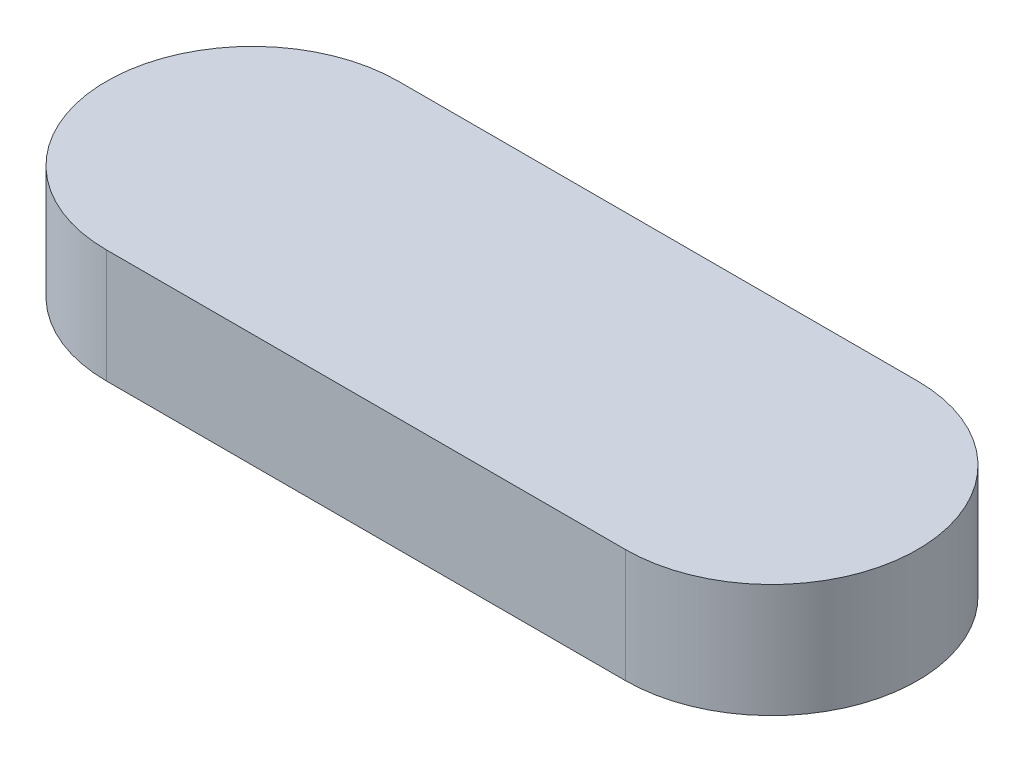
ISO-10303-21;
HEADER;
FILE_DESCRIPTION(('STEP AP214'),'2;1');
FILE_NAME('part.step','',(''),(''),'','','');
FILE_SCHEMA(('AUTOMOTIVE_DESIGN { 1 0 10303 214 1 1 1 1 }'));
ENDSEC;
DATA;
#1=APPLICATION_CONTEXT('core data for automotive mechanical design processes');
#2=APPLICATION_PROTOCOL_DEFINITION('international standard','automotive_design',2000,#1);
#3=PRODUCT_CONTEXT('',#1,'mechanical');
#4=PRODUCT('Part','Part','',(#3));
#5=PRODUCT_RELATED_PRODUCT_CATEGORY('part','',(#4));
#6=PRODUCT_DEFINITION_FORMATION('','',#4);
#7=PRODUCT_DEFINITION_CONTEXT('part definition',#1,'design');
#8=PRODUCT_DEFINITION('design','',#6,#7);
#9=PRODUCT_DEFINITION_SHAPE('','',#8);
#10=(LENGTH_UNIT() NAMED_UNIT(*) SI_UNIT(.MILLI.,.METRE.));
#11=(NAMED_UNIT(*) PLANE_ANGLE_UNIT() SI_UNIT($,.RADIAN.));
#12=(NAMED_UNIT(*) SI_UNIT($,.STERADIAN.) SOLID_ANGLE_UNIT());
#13=UNCERTAINTY_MEASURE_WITH_UNIT(LENGTH_MEASURE(1.E-05),#10,'distance_accuracy_value','');
#14=(GEOMETRIC_REPRESENTATION_CONTEXT(3) GLOBAL_UNCERTAINTY_ASSIGNED_CONTEXT((#13)) GLOBAL_UNIT_ASSIGNED_CONTEXT((#10,
#11,#12)) REPRESENTATION_CONTEXT('',''));
#15=CARTESIAN_POINT('',(0.,0.,0.));
#16=DIRECTION('',(0.,0.,1.));
#17=DIRECTION('',(1.,0.,0.));
#18=AXIS2_PLACEMENT_3D('',#15,#16,#17);
#19=CARTESIAN_POINT('',(16.,7.,0.));
#20=DIRECTION('',(0.,-1.,0.));
#21=DIRECTION('',(0.,0.,-1.));
#22=AXIS2_PLACEMENT_3D('',#19,#20,#21);
#23=CYLINDRICAL_SURFACE('',#22,9.);
#24=CARTESIAN_POINT('',(16.,0.,0.));
#25=DIRECTION('',(0.,1.,0.));
#26=DIRECTION('',(0.,0.,1.));
#27=AXIS2_PLACEMENT_3D('',#24,#25,#26);
#28=CIRCLE('',#27,9.);
#29=CARTESIAN_POINT('',(16.,0.,8.99999999999999));
#30=VERTEX_POINT('',#29);
#31=CARTESIAN_POINT('',(16.,0.,-9.00000000000001));
#32=VERTEX_POINT('',#31);
#33=EDGE_CURVE('E106',#30,#32,#28,.T.);
#34=ORIENTED_EDGE('',*,*,#33,.T.);
#35=DIRECTION('',(0.,-1.,0.));
#36=VECTOR('',#35,1.);
#37=CARTESIAN_POINT('',(16.,7.,-9.00000000000001));
#38=LINE('',#37,#36);
#39=CARTESIAN_POINT('',(16.,7.,-9.00000000000001));
#40=VERTEX_POINT('',#39);
#41=EDGE_CURVE('E11',#40,#32,#38,.T.);
#42=ORIENTED_EDGE('',*,*,#41,.F.);
#43=CARTESIAN_POINT('',(16.,7.,0.));
#44=DIRECTION('',(0.,1.,0.));
#45=DIRECTION('',(0.,0.,1.));
#46=AXIS2_PLACEMENT_3D('',#43,#44,#45);
#47=CIRCLE('',#46,9.);
#48=CARTESIAN_POINT('',(16.,7.,8.99999999999999));
#49=VERTEX_POINT('',#48);
#50=EDGE_CURVE('E94',#49,#40,#47,.T.);
#51=ORIENTED_EDGE('',*,*,#50,.F.);
#52=DIRECTION('',(0.,-1.,0.));
#53=VECTOR('',#52,1.);
#54=CARTESIAN_POINT('',(16.,7.,8.99999999999999));
#55=LINE('',#54,#53);
#56=EDGE_CURVE('E102',#49,#30,#55,.T.);
#57=ORIENTED_EDGE('',*,*,#56,.T.);
#58=EDGE_LOOP('',(#34,#42,#51,#57));
#59=FACE_BOUND('',#58,.T.);
#60=ADVANCED_FACE('F43',(#59),#23,.T.);
#61=CARTESIAN_POINT('',(16.,7.,-9.00000000000001));
#62=DIRECTION('',(0.,0.,1.));
#63=DIRECTION('',(1.,0.,0.));
#64=AXIS2_PLACEMENT_3D('',#61,#62,#63);
#65=PLANE('',#64);
#66=DIRECTION('',(-1.,0.,0.));
#67=VECTOR('',#66,1.);
#68=CARTESIAN_POINT('',(16.,0.,-9.00000000000001));
#69=LINE('',#68,#67);
#70=CARTESIAN_POINT('',(-16.,0.,-9.));
#71=VERTEX_POINT('',#70);
#72=EDGE_CURVE('E98',#32,#71,#69,.T.);
#73=ORIENTED_EDGE('',*,*,#72,.T.);
#74=DIRECTION('',(0.,-1.,0.));
#75=VECTOR('',#74,1.);
#76=CARTESIAN_POINT('',(-16.,7.,-9.));
#77=LINE('',#76,#75);
#78=CARTESIAN_POINT('',(-16.,7.,-9.));
#79=VERTEX_POINT('',#78);
#80=EDGE_CURVE('E51',#79,#71,#77,.T.);
#81=ORIENTED_EDGE('',*,*,#80,.F.);
#82=DIRECTION('',(-1.,0.,0.));
#83=VECTOR('',#82,1.);
#84=CARTESIAN_POINT('',(16.,7.,-9.00000000000001));
#85=LINE('',#84,#83);
#86=EDGE_CURVE('E89',#40,#79,#85,.T.);
#87=ORIENTED_EDGE('',*,*,#86,.F.);
#88=ORIENTED_EDGE('',*,*,#41,.T.);
#89=EDGE_LOOP('',(#73,#81,#87,#88));
#90=FACE_BOUND('',#89,.T.);
#91=ADVANCED_FACE('F97',(#90),#65,.F.);
#92=CARTESIAN_POINT('',(-16.,7.,0.));
#93=DIRECTION('',(0.,-1.,0.));
#94=DIRECTION('',(0.,0.,-1.));
#95=AXIS2_PLACEMENT_3D('',#92,#93,#94);
#96=CYLINDRICAL_SURFACE('',#95,9.);
#97=CARTESIAN_POINT('',(-16.,0.,0.));
#98=DIRECTION('',(0.,1.,0.));
#99=DIRECTION('',(0.,0.,1.));
#100=AXIS2_PLACEMENT_3D('',#97,#98,#99);
#101=CIRCLE('',#100,9.);
#102=CARTESIAN_POINT('',(-16.,0.,9.));
#103=VERTEX_POINT('',#102);
#104=EDGE_CURVE('E76',#71,#103,#101,.T.);
#105=ORIENTED_EDGE('',*,*,#104,.T.);
#106=DIRECTION('',(0.,-1.,0.));
#107=VECTOR('',#106,1.);
#108=CARTESIAN_POINT('',(-16.,7.,9.));
#109=LINE('',#108,#107);
#110=CARTESIAN_POINT('',(-16.,7.,9.));
#111=VERTEX_POINT('',#110);
#112=EDGE_CURVE('E99',#111,#103,#109,.T.);
#113=ORIENTED_EDGE('',*,*,#112,.F.);
#114=CARTESIAN_POINT('',(-16.,7.,0.));
#115=DIRECTION('',(0.,1.,0.));
#116=DIRECTION('',(0.,0.,1.));
#117=AXIS2_PLACEMENT_3D('',#114,#115,#116);
#118=CIRCLE('',#117,9.);
#119=EDGE_CURVE('E92',#79,#111,#118,.T.);
#120=ORIENTED_EDGE('',*,*,#119,.F.);
#121=ORIENTED_EDGE('',*,*,#80,.T.);
#122=EDGE_LOOP('',(#105,#113,#120,#121));
#123=FACE_BOUND('',#122,.T.);
#124=ADVANCED_FACE('F100',(#123),#96,.T.);
#125=CARTESIAN_POINT('',(16.,7.,8.99999999999999));
#126=DIRECTION('',(0.,0.,-1.));
#127=DIRECTION('',(-1.,0.,0.));
#128=AXIS2_PLACEMENT_3D('',#125,#126,#127);
#129=PLANE('',#128);
#130=DIRECTION('',(1.,0.,0.));
#131=VECTOR('',#130,1.);
#132=CARTESIAN_POINT('',(16.,0.,8.99999999999999));
#133=LINE('',#132,#131);
#134=EDGE_CURVE('E82',#103,#30,#133,.T.);
#135=ORIENTED_EDGE('',*,*,#134,.T.);
#136=ORIENTED_EDGE('',*,*,#56,.F.);
#137=DIRECTION('',(1.,0.,0.));
#138=VECTOR('',#137,1.);
#139=CARTESIAN_POINT('',(16.,7.,8.99999999999999));
#140=LINE('',#139,#138);
#141=EDGE_CURVE('E59',#111,#49,#140,.T.);
#142=ORIENTED_EDGE('',*,*,#141,.F.);
#143=ORIENTED_EDGE('',*,*,#112,.T.);
#144=EDGE_LOOP('',(#135,#136,#142,#143));
#145=FACE_BOUND('',#144,.T.);
#146=ADVANCED_FACE('F113',(#145),#129,.F.);
#147=CARTESIAN_POINT('',(16.,7.,0.));
#148=DIRECTION('',(0.,1.,0.));
#149=DIRECTION('',(0.,0.,1.));
#150=AXIS2_PLACEMENT_3D('',#147,#148,#149);
#151=PLANE('',#150);
#152=ORIENTED_EDGE('',*,*,#50,.T.);
#153=ORIENTED_EDGE('',*,*,#86,.T.);
#154=ORIENTED_EDGE('',*,*,#119,.T.);
#155=ORIENTED_EDGE('',*,*,#141,.T.);
#156=EDGE_LOOP('',(#152,#153,#154,#155));
#157=FACE_BOUND('',#156,.T.);
#158=ADVANCED_FACE('F90',(#157),#151,.T.);
#159=CARTESIAN_POINT('',(16.,0.,0.));
#160=DIRECTION('',(0.,1.,0.));
#161=DIRECTION('',(0.,0.,1.));
#162=AXIS2_PLACEMENT_3D('',#159,#160,#161);
#163=PLANE('',#162);
#164=ORIENTED_EDGE('',*,*,#33,.F.);
#165=ORIENTED_EDGE('',*,*,#134,.F.);
#166=ORIENTED_EDGE('',*,*,#104,.F.);
#167=ORIENTED_EDGE('',*,*,#72,.F.);
#168=EDGE_LOOP('',(#164,#165,#166,#167));
#169=FACE_BOUND('',#168,.T.);
#170=ADVANCED_FACE('F116',(#169),#163,.F.);
#171=CLOSED_SHELL('',(#60,#91,#124,#146,#158,#170));
#172=MANIFOLD_SOLID_BREP('B2',#171);
#173=ADVANCED_BREP_SHAPE_REPRESENTATION('',(#18,#172),#14);
#174=SHAPE_DEFINITION_REPRESENTATION(#9,#173);
ENDSEC;
END-ISO-10303-21;
